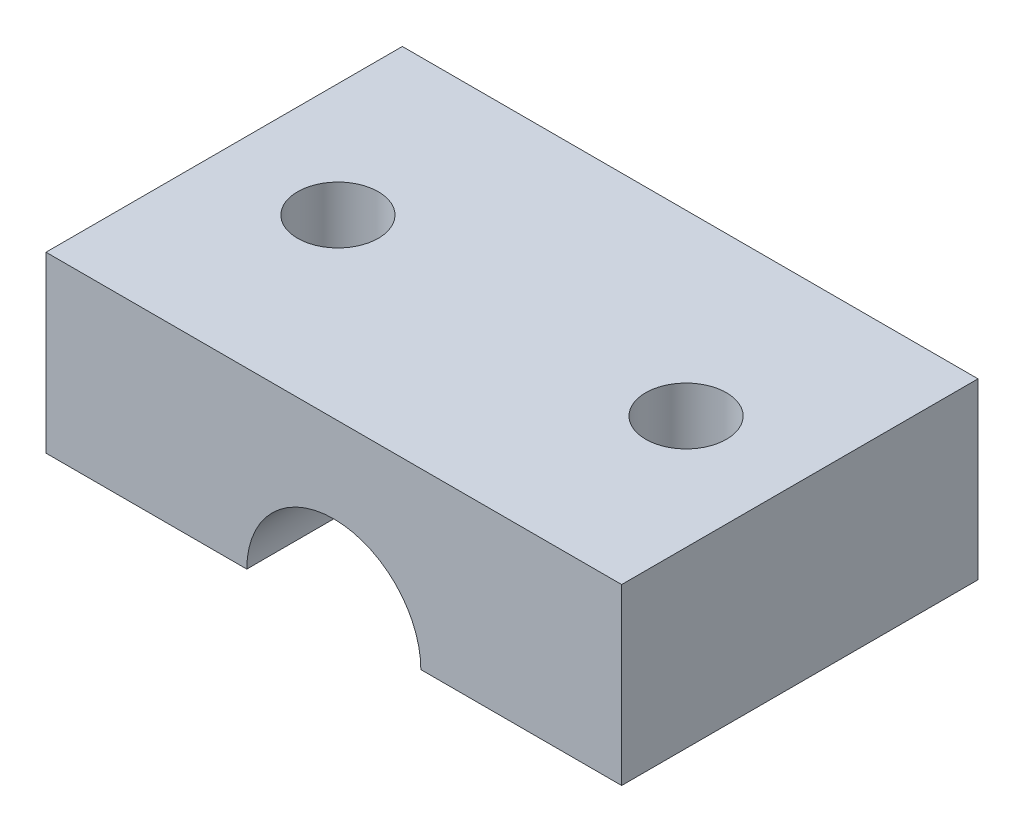
ISO-10303-21;
HEADER;
FILE_DESCRIPTION(('STEP AP214'),'2;1');
FILE_NAME('part.step','',(''),(''),'','','');
FILE_SCHEMA(('AUTOMOTIVE_DESIGN { 1 0 10303 214 1 1 1 1 }'));
ENDSEC;
DATA;
#1=APPLICATION_CONTEXT('core data for automotive mechanical design processes');
#2=APPLICATION_PROTOCOL_DEFINITION('international standard','automotive_design',2000,#1);
#3=PRODUCT_CONTEXT('',#1,'mechanical');
#4=PRODUCT('Part','Part','',(#3));
#5=PRODUCT_RELATED_PRODUCT_CATEGORY('part','',(#4));
#6=PRODUCT_DEFINITION_FORMATION('','',#4);
#7=PRODUCT_DEFINITION_CONTEXT('part definition',#1,'design');
#8=PRODUCT_DEFINITION('design','',#6,#7);
#9=PRODUCT_DEFINITION_SHAPE('','',#8);
#10=(LENGTH_UNIT() NAMED_UNIT(*) SI_UNIT(.MILLI.,.METRE.));
#11=(NAMED_UNIT(*) PLANE_ANGLE_UNIT() SI_UNIT($,.RADIAN.));
#12=(NAMED_UNIT(*) SI_UNIT($,.STERADIAN.) SOLID_ANGLE_UNIT());
#13=UNCERTAINTY_MEASURE_WITH_UNIT(LENGTH_MEASURE(1.E-05),#10,'distance_accuracy_value','');
#14=(GEOMETRIC_REPRESENTATION_CONTEXT(3) GLOBAL_UNCERTAINTY_ASSIGNED_CONTEXT((#13)) GLOBAL_UNIT_ASSIGNED_CONTEXT((#10,
#11,#12)) REPRESENTATION_CONTEXT('',''));
#15=CARTESIAN_POINT('',(0.,0.,0.));
#16=DIRECTION('',(0.,0.,1.));
#17=DIRECTION('',(1.,0.,0.));
#18=AXIS2_PLACEMENT_3D('',#15,#16,#17);
#19=CARTESIAN_POINT('',(0.,0.,0.));
#20=DIRECTION('',(0.,1.,0.));
#21=DIRECTION('',(0.,0.,1.));
#22=AXIS2_PLACEMENT_3D('',#19,#20,#21);
#23=PLANE('',#22);
#24=CARTESIAN_POINT('',(26.85,0.,6.5));
#25=DIRECTION('',(0.,1.,0.));
#26=DIRECTION('',(0.,0.,1.));
#27=AXIS2_PLACEMENT_3D('',#24,#25,#26);
#28=CIRCLE('',#27,1.4732);
#29=CARTESIAN_POINT('',(26.85,0.,7.9732));
#30=VERTEX_POINT('',#29);
#31=EDGE_CURVE('E105',#30,#30,#28,.T.);
#32=ORIENTED_EDGE('',*,*,#31,.T.);
#33=EDGE_LOOP('',(#32));
#34=FACE_BOUND('',#33,.T.);
#35=DIRECTION('',(1.,0.,0.));
#36=VECTOR('',#35,1.);
#37=CARTESIAN_POINT('',(0.,0.,13.));
#38=LINE('',#37,#36);
#39=CARTESIAN_POINT('',(23.675,0.,13.));
#40=VERTEX_POINT('',#39);
#41=CARTESIAN_POINT('',(31.,0.,13.));
#42=VERTEX_POINT('',#41);
#43=EDGE_CURVE('E101',#40,#42,#38,.T.);
#44=ORIENTED_EDGE('',*,*,#43,.F.);
#45=DIRECTION('',(0.,0.,-1.));
#46=VECTOR('',#45,1.);
#47=CARTESIAN_POINT('',(23.675,0.,21.9802561210692));
#48=LINE('',#47,#46);
#49=CARTESIAN_POINT('',(23.675,0.,0.));
#50=VERTEX_POINT('',#49);
#51=EDGE_CURVE('E11',#40,#50,#48,.T.);
#52=ORIENTED_EDGE('',*,*,#51,.T.);
#53=DIRECTION('',(1.,0.,0.));
#54=VECTOR('',#53,1.);
#55=CARTESIAN_POINT('',(0.,0.,0.));
#56=LINE('',#55,#54);
#57=CARTESIAN_POINT('',(31.,0.,0.));
#58=VERTEX_POINT('',#57);
#59=EDGE_CURVE('E79',#50,#58,#56,.T.);
#60=ORIENTED_EDGE('',*,*,#59,.T.);
#61=DIRECTION('',(0.,0.,1.));
#62=VECTOR('',#61,1.);
#63=CARTESIAN_POINT('',(31.,0.,0.));
#64=LINE('',#63,#62);
#65=EDGE_CURVE('E107',#58,#42,#64,.T.);
#66=ORIENTED_EDGE('',*,*,#65,.T.);
#67=EDGE_LOOP('',(#44,#52,#60,#66));
#68=FACE_BOUND('',#67,.T.);
#69=ADVANCED_FACE('F33',(#34,#68),#23,.F.);
#70=CARTESIAN_POINT('',(0.,6.35,0.));
#71=DIRECTION('',(0.,0.,-1.));
#72=DIRECTION('',(-1.,0.,0.));
#73=AXIS2_PLACEMENT_3D('',#70,#71,#72);
#74=PLANE('',#73);
#75=CARTESIAN_POINT('',(20.5,0.,0.));
#76=DIRECTION('',(0.,0.,-1.));
#77=DIRECTION('',(-1.,0.,0.));
#78=AXIS2_PLACEMENT_3D('',#75,#76,#77);
#79=CIRCLE('',#78,3.175);
#80=CARTESIAN_POINT('',(17.325,0.,0.));
#81=VERTEX_POINT('',#80);
#82=EDGE_CURVE('E95',#81,#50,#79,.T.);
#83=ORIENTED_EDGE('',*,*,#82,.F.);
#84=CARTESIAN_POINT('',(10.,0.,0.));
#85=VERTEX_POINT('',#84);
#86=EDGE_CURVE('E111',#85,#81,#56,.T.);
#87=ORIENTED_EDGE('',*,*,#86,.F.);
#88=DIRECTION('',(0.,-1.,0.));
#89=VECTOR('',#88,1.);
#90=CARTESIAN_POINT('',(10.,6.35,0.));
#91=LINE('',#90,#89);
#92=CARTESIAN_POINT('',(10.,6.35,0.));
#93=VERTEX_POINT('',#92);
#94=EDGE_CURVE('E84',#93,#85,#91,.T.);
#95=ORIENTED_EDGE('',*,*,#94,.F.);
#96=DIRECTION('',(1.,0.,0.));
#97=VECTOR('',#96,1.);
#98=CARTESIAN_POINT('',(0.,6.35,0.));
#99=LINE('',#98,#97);
#100=CARTESIAN_POINT('',(31.,6.35,0.));
#101=VERTEX_POINT('',#100);
#102=EDGE_CURVE('E135',#93,#101,#99,.T.);
#103=ORIENTED_EDGE('',*,*,#102,.T.);
#104=DIRECTION('',(0.,-1.,0.));
#105=VECTOR('',#104,1.);
#106=CARTESIAN_POINT('',(31.,6.35,0.));
#107=LINE('',#106,#105);
#108=EDGE_CURVE('E57',#101,#58,#107,.T.);
#109=ORIENTED_EDGE('',*,*,#108,.T.);
#110=ORIENTED_EDGE('',*,*,#59,.F.);
#111=EDGE_LOOP('',(#83,#87,#95,#103,#109,#110));
#112=FACE_BOUND('',#111,.T.);
#113=ADVANCED_FACE('F127',(#112),#74,.T.);
#114=CARTESIAN_POINT('',(10.,6.35,0.));
#115=DIRECTION('',(1.,0.,0.));
#116=DIRECTION('',(0.,0.,-1.));
#117=AXIS2_PLACEMENT_3D('',#114,#115,#116);
#118=PLANE('',#117);
#119=DIRECTION('',(0.,0.,1.));
#120=VECTOR('',#119,1.);
#121=CARTESIAN_POINT('',(10.,0.,0.));
#122=LINE('',#121,#120);
#123=CARTESIAN_POINT('',(10.,0.,13.));
#124=VERTEX_POINT('',#123);
#125=EDGE_CURVE('E108',#85,#124,#122,.T.);
#126=ORIENTED_EDGE('',*,*,#125,.T.);
#127=DIRECTION('',(0.,-1.,0.));
#128=VECTOR('',#127,1.);
#129=CARTESIAN_POINT('',(10.,6.35,13.));
#130=LINE('',#129,#128);
#131=CARTESIAN_POINT('',(10.,6.35,13.));
#132=VERTEX_POINT('',#131);
#133=EDGE_CURVE('E121',#132,#124,#130,.T.);
#134=ORIENTED_EDGE('',*,*,#133,.F.);
#135=DIRECTION('',(0.,0.,1.));
#136=VECTOR('',#135,1.);
#137=CARTESIAN_POINT('',(10.,6.35,0.));
#138=LINE('',#137,#136);
#139=EDGE_CURVE('E137',#93,#132,#138,.T.);
#140=ORIENTED_EDGE('',*,*,#139,.F.);
#141=ORIENTED_EDGE('',*,*,#94,.T.);
#142=EDGE_LOOP('',(#126,#134,#140,#141));
#143=FACE_BOUND('',#142,.T.);
#144=ADVANCED_FACE('F159',(#143),#118,.F.);
#145=CARTESIAN_POINT('',(0.,6.35,13.));
#146=DIRECTION('',(0.,0.,-1.));
#147=DIRECTION('',(-1.,0.,0.));
#148=AXIS2_PLACEMENT_3D('',#145,#146,#147);
#149=PLANE('',#148);
#150=CARTESIAN_POINT('',(17.325,0.,13.));
#151=VERTEX_POINT('',#150);
#152=EDGE_CURVE('E104',#124,#151,#38,.T.);
#153=ORIENTED_EDGE('',*,*,#152,.T.);
#154=CARTESIAN_POINT('',(20.5,0.,13.));
#155=DIRECTION('',(0.,0.,-1.));
#156=DIRECTION('',(-1.,0.,0.));
#157=AXIS2_PLACEMENT_3D('',#154,#155,#156);
#158=CIRCLE('',#157,3.175);
#159=EDGE_CURVE('E48',#40,#151,#158,.F.);
#160=ORIENTED_EDGE('',*,*,#159,.F.);
#161=ORIENTED_EDGE('',*,*,#43,.T.);
#162=DIRECTION('',(0.,-1.,0.));
#163=VECTOR('',#162,1.);
#164=CARTESIAN_POINT('',(31.,6.35,13.));
#165=LINE('',#164,#163);
#166=CARTESIAN_POINT('',(31.,6.35,13.));
#167=VERTEX_POINT('',#166);
#168=EDGE_CURVE('E118',#167,#42,#165,.T.);
#169=ORIENTED_EDGE('',*,*,#168,.F.);
#170=DIRECTION('',(1.,0.,0.));
#171=VECTOR('',#170,1.);
#172=CARTESIAN_POINT('',(0.,6.35,13.));
#173=LINE('',#172,#171);
#174=EDGE_CURVE('E140',#132,#167,#173,.T.);
#175=ORIENTED_EDGE('',*,*,#174,.F.);
#176=ORIENTED_EDGE('',*,*,#133,.T.);
#177=EDGE_LOOP('',(#153,#160,#161,#169,#175,#176));
#178=FACE_BOUND('',#177,.T.);
#179=ADVANCED_FACE('F99',(#178),#149,.F.);
#180=CARTESIAN_POINT('',(14.15,6.35,6.5));
#181=DIRECTION('',(0.,-1.,0.));
#182=DIRECTION('',(0.,0.,-1.));
#183=AXIS2_PLACEMENT_3D('',#180,#181,#182);
#184=CYLINDRICAL_SURFACE('',#183,1.4732);
#185=CARTESIAN_POINT('',(14.15,6.35,6.5));
#186=DIRECTION('',(0.,1.,0.));
#187=DIRECTION('',(0.,0.,1.));
#188=AXIS2_PLACEMENT_3D('',#185,#186,#187);
#189=CIRCLE('',#188,1.4732);
#190=CARTESIAN_POINT('',(14.15,6.35,7.9732));
#191=VERTEX_POINT('',#190);
#192=EDGE_CURVE('E132',#191,#191,#189,.T.);
#193=ORIENTED_EDGE('',*,*,#192,.T.);
#194=EDGE_LOOP('',(#193));
#195=FACE_BOUND('',#194,.T.);
#196=CARTESIAN_POINT('',(14.15,0.,6.5));
#197=DIRECTION('',(0.,1.,0.));
#198=DIRECTION('',(0.,0.,1.));
#199=AXIS2_PLACEMENT_3D('',#196,#197,#198);
#200=CIRCLE('',#199,1.4732);
#201=CARTESIAN_POINT('',(14.15,0.,7.9732));
#202=VERTEX_POINT('',#201);
#203=EDGE_CURVE('E145',#202,#202,#200,.T.);
#204=ORIENTED_EDGE('',*,*,#203,.F.);
#205=EDGE_LOOP('',(#204));
#206=FACE_BOUND('',#205,.T.);
#207=ADVANCED_FACE('F150',(#195,#206),#184,.F.);
#208=CARTESIAN_POINT('',(26.85,6.35,6.5));
#209=DIRECTION('',(0.,-1.,0.));
#210=DIRECTION('',(0.,0.,-1.));
#211=AXIS2_PLACEMENT_3D('',#208,#209,#210);
#212=CYLINDRICAL_SURFACE('',#211,1.4732);
#213=CARTESIAN_POINT('',(26.85,6.35,6.5));
#214=DIRECTION('',(0.,1.,0.));
#215=DIRECTION('',(0.,0.,1.));
#216=AXIS2_PLACEMENT_3D('',#213,#214,#215);
#217=CIRCLE('',#216,1.4732);
#218=CARTESIAN_POINT('',(26.85,6.35,7.9732));
#219=VERTEX_POINT('',#218);
#220=EDGE_CURVE('E116',#219,#219,#217,.T.);
#221=ORIENTED_EDGE('',*,*,#220,.T.);
#222=EDGE_LOOP('',(#221));
#223=FACE_BOUND('',#222,.T.);
#224=ORIENTED_EDGE('',*,*,#31,.F.);
#225=EDGE_LOOP('',(#224));
#226=FACE_BOUND('',#225,.T.);
#227=ADVANCED_FACE('F35',(#223,#226),#212,.F.);
#228=CARTESIAN_POINT('',(31.,6.35,0.));
#229=DIRECTION('',(1.,0.,0.));
#230=DIRECTION('',(0.,0.,-1.));
#231=AXIS2_PLACEMENT_3D('',#228,#229,#230);
#232=PLANE('',#231);
#233=ORIENTED_EDGE('',*,*,#65,.F.);
#234=ORIENTED_EDGE('',*,*,#108,.F.);
#235=DIRECTION('',(0.,0.,1.));
#236=VECTOR('',#235,1.);
#237=CARTESIAN_POINT('',(31.,6.35,0.));
#238=LINE('',#237,#236);
#239=EDGE_CURVE('E119',#101,#167,#238,.T.);
#240=ORIENTED_EDGE('',*,*,#239,.T.);
#241=ORIENTED_EDGE('',*,*,#168,.T.);
#242=EDGE_LOOP('',(#233,#234,#240,#241));
#243=FACE_BOUND('',#242,.T.);
#244=ADVANCED_FACE('F157',(#243),#232,.T.);
#245=CARTESIAN_POINT('',(0.,6.35,0.));
#246=DIRECTION('',(0.,1.,0.));
#247=DIRECTION('',(0.,0.,1.));
#248=AXIS2_PLACEMENT_3D('',#245,#246,#247);
#249=PLANE('',#248);
#250=ORIENTED_EDGE('',*,*,#220,.F.);
#251=EDGE_LOOP('',(#250));
#252=FACE_BOUND('',#251,.T.);
#253=ORIENTED_EDGE('',*,*,#192,.F.);
#254=EDGE_LOOP('',(#253));
#255=FACE_BOUND('',#254,.T.);
#256=ORIENTED_EDGE('',*,*,#102,.F.);
#257=ORIENTED_EDGE('',*,*,#139,.T.);
#258=ORIENTED_EDGE('',*,*,#174,.T.);
#259=ORIENTED_EDGE('',*,*,#239,.F.);
#260=EDGE_LOOP('',(#256,#257,#258,#259));
#261=FACE_BOUND('',#260,.T.);
#262=ADVANCED_FACE('F171',(#252,#255,#261),#249,.T.);
#263=ORIENTED_EDGE('',*,*,#203,.T.);
#264=EDGE_LOOP('',(#263));
#265=FACE_BOUND('',#264,.T.);
#266=ORIENTED_EDGE('',*,*,#86,.T.);
#267=DIRECTION('',(0.,0.,-1.));
#268=VECTOR('',#267,1.);
#269=CARTESIAN_POINT('',(17.325,0.,21.9802561210692));
#270=LINE('',#269,#268);
#271=EDGE_CURVE('E41',#81,#151,#270,.F.);
#272=ORIENTED_EDGE('',*,*,#271,.T.);
#273=ORIENTED_EDGE('',*,*,#152,.F.);
#274=ORIENTED_EDGE('',*,*,#125,.F.);
#275=EDGE_LOOP('',(#266,#272,#273,#274));
#276=FACE_BOUND('',#275,.T.);
#277=ADVANCED_FACE('F125',(#265,#276),#23,.F.);
#278=CARTESIAN_POINT('',(20.5,0.,21.9802561210692));
#279=DIRECTION('',(0.,0.,-1.));
#280=DIRECTION('',(-1.,0.,0.));
#281=AXIS2_PLACEMENT_3D('',#278,#279,#280);
#282=CYLINDRICAL_SURFACE('',#281,3.175);
#283=ORIENTED_EDGE('',*,*,#159,.T.);
#284=ORIENTED_EDGE('',*,*,#271,.F.);
#285=ORIENTED_EDGE('',*,*,#82,.T.);
#286=ORIENTED_EDGE('',*,*,#51,.F.);
#287=EDGE_LOOP('',(#283,#284,#285,#286));
#288=FACE_BOUND('',#287,.T.);
#289=ADVANCED_FACE('F93',(#288),#282,.F.);
#290=CLOSED_SHELL('',(#69,#113,#144,#179,#207,#227,#244,#262,#277,#289));
#291=MANIFOLD_SOLID_BREP('B2',#290);
#292=ADVANCED_BREP_SHAPE_REPRESENTATION('',(#18,#291),#14);
#293=SHAPE_DEFINITION_REPRESENTATION(#9,#292);
ENDSEC;
END-ISO-10303-21;
